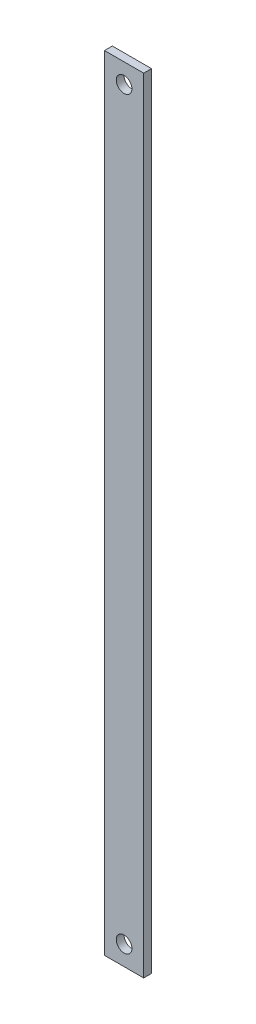
ISO-10303-21;
HEADER;
FILE_DESCRIPTION(('STEP AP214'),'2;1');
FILE_NAME('part.step','',(''),(''),'','','');
FILE_SCHEMA(('AUTOMOTIVE_DESIGN { 1 0 10303 214 1 1 1 1 }'));
ENDSEC;
DATA;
#1=APPLICATION_CONTEXT('core data for automotive mechanical design processes');
#2=APPLICATION_PROTOCOL_DEFINITION('international standard','automotive_design',2000,#1);
#3=PRODUCT_CONTEXT('',#1,'mechanical');
#4=PRODUCT('Part','Part','',(#3));
#5=PRODUCT_RELATED_PRODUCT_CATEGORY('part','',(#4));
#6=PRODUCT_DEFINITION_FORMATION('','',#4);
#7=PRODUCT_DEFINITION_CONTEXT('part definition',#1,'design');
#8=PRODUCT_DEFINITION('design','',#6,#7);
#9=PRODUCT_DEFINITION_SHAPE('','',#8);
#10=(LENGTH_UNIT() NAMED_UNIT(*) SI_UNIT(.MILLI.,.METRE.));
#11=(NAMED_UNIT(*) PLANE_ANGLE_UNIT() SI_UNIT($,.RADIAN.));
#12=(NAMED_UNIT(*) SI_UNIT($,.STERADIAN.) SOLID_ANGLE_UNIT());
#13=UNCERTAINTY_MEASURE_WITH_UNIT(LENGTH_MEASURE(1.E-05),#10,'distance_accuracy_value','');
#14=(GEOMETRIC_REPRESENTATION_CONTEXT(3) GLOBAL_UNCERTAINTY_ASSIGNED_CONTEXT((#13)) GLOBAL_UNIT_ASSIGNED_CONTEXT((#10,
#11,#12)) REPRESENTATION_CONTEXT('',''));
#15=CARTESIAN_POINT('',(0.,0.,0.));
#16=DIRECTION('',(0.,0.,1.));
#17=DIRECTION('',(1.,0.,0.));
#18=AXIS2_PLACEMENT_3D('',#15,#16,#17);
#19=CARTESIAN_POINT('',(0.,0.,2.));
#20=DIRECTION('',(0.,0.,1.));
#21=DIRECTION('',(1.,0.,0.));
#22=AXIS2_PLACEMENT_3D('',#19,#20,#21);
#23=PLANE('',#22);
#24=CARTESIAN_POINT('',(0.,-95.,2.));
#25=DIRECTION('',(0.,0.,1.));
#26=DIRECTION('',(1.,0.,0.));
#27=AXIS2_PLACEMENT_3D('',#24,#25,#26);
#28=CIRCLE('',#27,2.);
#29=CARTESIAN_POINT('',(2.00000000000001,-95.,2.));
#30=VERTEX_POINT('',#29);
#31=EDGE_CURVE('E102',#30,#30,#28,.T.);
#32=ORIENTED_EDGE('',*,*,#31,.F.);
#33=EDGE_LOOP('',(#32));
#34=FACE_BOUND('',#33,.T.);
#35=DIRECTION('',(0.,1.,0.));
#36=VECTOR('',#35,1.);
#37=CARTESIAN_POINT('',(4.99999999999999,100.,2.));
#38=LINE('',#37,#36);
#39=CARTESIAN_POINT('',(5.00000000000001,-100.,2.));
#40=VERTEX_POINT('',#39);
#41=CARTESIAN_POINT('',(4.99999999999999,100.,2.));
#42=VERTEX_POINT('',#41);
#43=EDGE_CURVE('E87',#40,#42,#38,.T.);
#44=ORIENTED_EDGE('',*,*,#43,.T.);
#45=DIRECTION('',(-1.,0.,0.));
#46=VECTOR('',#45,1.);
#47=CARTESIAN_POINT('',(-5.00000000000001,100.,2.));
#48=LINE('',#47,#46);
#49=CARTESIAN_POINT('',(-5.00000000000001,100.,2.));
#50=VERTEX_POINT('',#49);
#51=EDGE_CURVE('E82',#42,#50,#48,.T.);
#52=ORIENTED_EDGE('',*,*,#51,.T.);
#53=DIRECTION('',(0.,-1.,0.));
#54=VECTOR('',#53,1.);
#55=CARTESIAN_POINT('',(-5.00000000000001,100.,2.));
#56=LINE('',#55,#54);
#57=CARTESIAN_POINT('',(-4.99999999999999,-100.,2.));
#58=VERTEX_POINT('',#57);
#59=EDGE_CURVE('E85',#50,#58,#56,.T.);
#60=ORIENTED_EDGE('',*,*,#59,.T.);
#61=DIRECTION('',(1.,0.,0.));
#62=VECTOR('',#61,1.);
#63=CARTESIAN_POINT('',(-4.99999999999999,-100.,2.));
#64=LINE('',#63,#62);
#65=EDGE_CURVE('E52',#58,#40,#64,.T.);
#66=ORIENTED_EDGE('',*,*,#65,.T.);
#67=EDGE_LOOP('',(#44,#52,#60,#66));
#68=FACE_BOUND('',#67,.T.);
#69=CARTESIAN_POINT('',(0.,95.,2.));
#70=DIRECTION('',(0.,0.,1.));
#71=DIRECTION('',(-1.,0.,0.));
#72=AXIS2_PLACEMENT_3D('',#69,#70,#71);
#73=CIRCLE('',#72,2.);
#74=CARTESIAN_POINT('',(-1.99999999999999,95.,2.));
#75=VERTEX_POINT('',#74);
#76=EDGE_CURVE('E117',#75,#75,#73,.T.);
#77=ORIENTED_EDGE('',*,*,#76,.F.);
#78=EDGE_LOOP('',(#77));
#79=FACE_BOUND('',#78,.T.);
#80=ADVANCED_FACE('F35',(#34,#68,#79),#23,.T.);
#81=CARTESIAN_POINT('',(0.,0.,0.));
#82=DIRECTION('',(0.,0.,1.));
#83=DIRECTION('',(1.,0.,0.));
#84=AXIS2_PLACEMENT_3D('',#81,#82,#83);
#85=PLANE('',#84);
#86=DIRECTION('',(0.,1.,0.));
#87=VECTOR('',#86,1.);
#88=CARTESIAN_POINT('',(4.99999999999999,100.,0.));
#89=LINE('',#88,#87);
#90=CARTESIAN_POINT('',(5.00000000000001,-100.,0.));
#91=VERTEX_POINT('',#90);
#92=CARTESIAN_POINT('',(4.99999999999999,100.,0.));
#93=VERTEX_POINT('',#92);
#94=EDGE_CURVE('E99',#91,#93,#89,.T.);
#95=ORIENTED_EDGE('',*,*,#94,.F.);
#96=DIRECTION('',(1.,0.,0.));
#97=VECTOR('',#96,1.);
#98=CARTESIAN_POINT('',(-4.99999999999999,-100.,0.));
#99=LINE('',#98,#97);
#100=CARTESIAN_POINT('',(-4.99999999999999,-100.,0.));
#101=VERTEX_POINT('',#100);
#102=EDGE_CURVE('E75',#101,#91,#99,.T.);
#103=ORIENTED_EDGE('',*,*,#102,.F.);
#104=DIRECTION('',(0.,-1.,0.));
#105=VECTOR('',#104,1.);
#106=CARTESIAN_POINT('',(-5.00000000000001,100.,0.));
#107=LINE('',#106,#105);
#108=CARTESIAN_POINT('',(-5.00000000000001,100.,0.));
#109=VERTEX_POINT('',#108);
#110=EDGE_CURVE('E69',#109,#101,#107,.T.);
#111=ORIENTED_EDGE('',*,*,#110,.F.);
#112=DIRECTION('',(-1.,0.,0.));
#113=VECTOR('',#112,1.);
#114=CARTESIAN_POINT('',(-5.00000000000001,100.,0.));
#115=LINE('',#114,#113);
#116=EDGE_CURVE('E91',#93,#109,#115,.T.);
#117=ORIENTED_EDGE('',*,*,#116,.F.);
#118=EDGE_LOOP('',(#95,#103,#111,#117));
#119=FACE_BOUND('',#118,.T.);
#120=CARTESIAN_POINT('',(0.,-95.,0.));
#121=DIRECTION('',(0.,0.,1.));
#122=DIRECTION('',(1.,0.,0.));
#123=AXIS2_PLACEMENT_3D('',#120,#121,#122);
#124=CIRCLE('',#123,2.);
#125=CARTESIAN_POINT('',(2.00000000000001,-95.,0.));
#126=VERTEX_POINT('',#125);
#127=EDGE_CURVE('E114',#126,#126,#124,.T.);
#128=ORIENTED_EDGE('',*,*,#127,.T.);
#129=EDGE_LOOP('',(#128));
#130=FACE_BOUND('',#129,.T.);
#131=CARTESIAN_POINT('',(0.,95.,0.));
#132=DIRECTION('',(0.,0.,1.));
#133=DIRECTION('',(-1.,0.,0.));
#134=AXIS2_PLACEMENT_3D('',#131,#132,#133);
#135=CIRCLE('',#134,2.);
#136=CARTESIAN_POINT('',(-1.99999999999999,95.,0.));
#137=VERTEX_POINT('',#136);
#138=EDGE_CURVE('E120',#137,#137,#135,.T.);
#139=ORIENTED_EDGE('',*,*,#138,.T.);
#140=EDGE_LOOP('',(#139));
#141=FACE_BOUND('',#140,.T.);
#142=ADVANCED_FACE('F110',(#119,#130,#141),#85,.F.);
#143=CARTESIAN_POINT('',(4.99999999999999,100.,2.));
#144=DIRECTION('',(-1.,0.,0.));
#145=DIRECTION('',(0.,-1.,0.));
#146=AXIS2_PLACEMENT_3D('',#143,#144,#145);
#147=PLANE('',#146);
#148=ORIENTED_EDGE('',*,*,#94,.T.);
#149=DIRECTION('',(0.,0.,-1.));
#150=VECTOR('',#149,1.);
#151=CARTESIAN_POINT('',(4.99999999999999,100.,2.));
#152=LINE('',#151,#150);
#153=EDGE_CURVE('E11',#42,#93,#152,.T.);
#154=ORIENTED_EDGE('',*,*,#153,.F.);
#155=ORIENTED_EDGE('',*,*,#43,.F.);
#156=DIRECTION('',(0.,0.,-1.));
#157=VECTOR('',#156,1.);
#158=CARTESIAN_POINT('',(5.00000000000001,-100.,2.));
#159=LINE('',#158,#157);
#160=EDGE_CURVE('E95',#40,#91,#159,.T.);
#161=ORIENTED_EDGE('',*,*,#160,.T.);
#162=EDGE_LOOP('',(#148,#154,#155,#161));
#163=FACE_BOUND('',#162,.T.);
#164=ADVANCED_FACE('F37',(#163),#147,.F.);
#165=CARTESIAN_POINT('',(-5.00000000000001,100.,2.));
#166=DIRECTION('',(0.,-1.,0.));
#167=DIRECTION('',(0.,0.,-1.));
#168=AXIS2_PLACEMENT_3D('',#165,#166,#167);
#169=PLANE('',#168);
#170=ORIENTED_EDGE('',*,*,#116,.T.);
#171=DIRECTION('',(0.,0.,-1.));
#172=VECTOR('',#171,1.);
#173=CARTESIAN_POINT('',(-5.00000000000001,100.,2.));
#174=LINE('',#173,#172);
#175=EDGE_CURVE('E44',#50,#109,#174,.T.);
#176=ORIENTED_EDGE('',*,*,#175,.F.);
#177=ORIENTED_EDGE('',*,*,#51,.F.);
#178=ORIENTED_EDGE('',*,*,#153,.T.);
#179=EDGE_LOOP('',(#170,#176,#177,#178));
#180=FACE_BOUND('',#179,.T.);
#181=ADVANCED_FACE('F90',(#180),#169,.F.);
#182=CARTESIAN_POINT('',(-5.00000000000001,100.,2.));
#183=DIRECTION('',(1.,0.,0.));
#184=DIRECTION('',(0.,1.,0.));
#185=AXIS2_PLACEMENT_3D('',#182,#183,#184);
#186=PLANE('',#185);
#187=ORIENTED_EDGE('',*,*,#110,.T.);
#188=DIRECTION('',(0.,0.,-1.));
#189=VECTOR('',#188,1.);
#190=CARTESIAN_POINT('',(-4.99999999999999,-100.,2.));
#191=LINE('',#190,#189);
#192=EDGE_CURVE('E92',#58,#101,#191,.T.);
#193=ORIENTED_EDGE('',*,*,#192,.F.);
#194=ORIENTED_EDGE('',*,*,#59,.F.);
#195=ORIENTED_EDGE('',*,*,#175,.T.);
#196=EDGE_LOOP('',(#187,#193,#194,#195));
#197=FACE_BOUND('',#196,.T.);
#198=ADVANCED_FACE('F93',(#197),#186,.F.);
#199=CARTESIAN_POINT('',(-4.99999999999999,-100.,2.));
#200=DIRECTION('',(0.,1.,0.));
#201=DIRECTION('',(0.,0.,1.));
#202=AXIS2_PLACEMENT_3D('',#199,#200,#201);
#203=PLANE('',#202);
#204=ORIENTED_EDGE('',*,*,#102,.T.);
#205=ORIENTED_EDGE('',*,*,#160,.F.);
#206=ORIENTED_EDGE('',*,*,#65,.F.);
#207=ORIENTED_EDGE('',*,*,#192,.T.);
#208=EDGE_LOOP('',(#204,#205,#206,#207));
#209=FACE_BOUND('',#208,.T.);
#210=ADVANCED_FACE('F107',(#209),#203,.F.);
#211=CARTESIAN_POINT('',(0.,-95.,2.));
#212=DIRECTION('',(0.,0.,-1.));
#213=DIRECTION('',(-1.,0.,0.));
#214=AXIS2_PLACEMENT_3D('',#211,#212,#213);
#215=CYLINDRICAL_SURFACE('',#214,2.);
#216=ORIENTED_EDGE('',*,*,#31,.T.);
#217=EDGE_LOOP('',(#216));
#218=FACE_BOUND('',#217,.T.);
#219=ORIENTED_EDGE('',*,*,#127,.F.);
#220=EDGE_LOOP('',(#219));
#221=FACE_BOUND('',#220,.T.);
#222=ADVANCED_FACE('F137',(#218,#221),#215,.F.);
#223=CARTESIAN_POINT('',(0.,95.,2.));
#224=DIRECTION('',(0.,0.,-1.));
#225=DIRECTION('',(-1.,0.,0.));
#226=AXIS2_PLACEMENT_3D('',#223,#224,#225);
#227=CYLINDRICAL_SURFACE('',#226,2.);
#228=ORIENTED_EDGE('',*,*,#76,.T.);
#229=EDGE_LOOP('',(#228));
#230=FACE_BOUND('',#229,.T.);
#231=ORIENTED_EDGE('',*,*,#138,.F.);
#232=EDGE_LOOP('',(#231));
#233=FACE_BOUND('',#232,.T.);
#234=ADVANCED_FACE('F126',(#230,#233),#227,.F.);
#235=CLOSED_SHELL('',(#80,#142,#164,#181,#198,#210,#222,#234));
#236=MANIFOLD_SOLID_BREP('B2',#235);
#237=ADVANCED_BREP_SHAPE_REPRESENTATION('',(#18,#236),#14);
#238=SHAPE_DEFINITION_REPRESENTATION(#9,#237);
ENDSEC;
END-ISO-10303-21;
